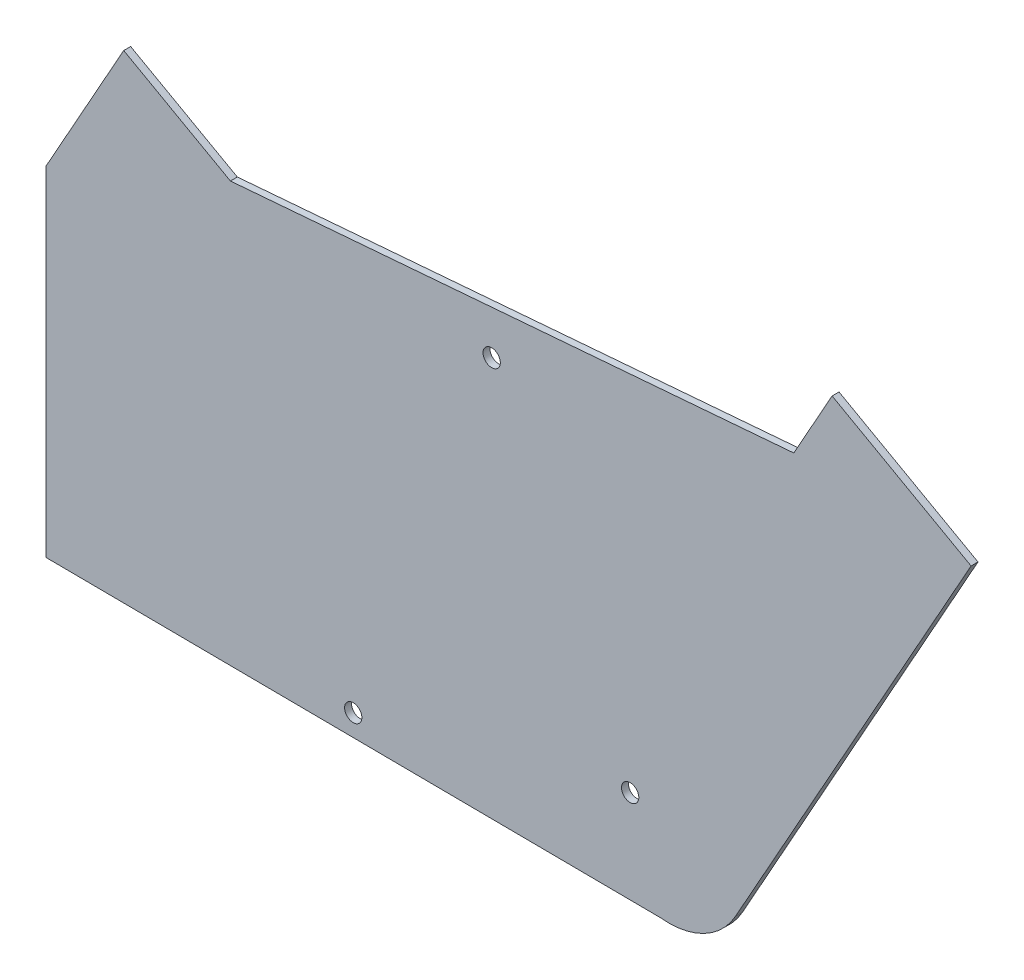
ISO-10303-21;
HEADER;
FILE_DESCRIPTION(('STEP AP214'),'2;1');
FILE_NAME('part.step','',(''),(''),'','','');
FILE_SCHEMA(('AUTOMOTIVE_DESIGN { 1 0 10303 214 1 1 1 1 }'));
ENDSEC;
DATA;
#1=APPLICATION_CONTEXT('core data for automotive mechanical design processes');
#2=APPLICATION_PROTOCOL_DEFINITION('international standard','automotive_design',2000,#1);
#3=PRODUCT_CONTEXT('',#1,'mechanical');
#4=PRODUCT('Part','Part','',(#3));
#5=PRODUCT_RELATED_PRODUCT_CATEGORY('part','',(#4));
#6=PRODUCT_DEFINITION_FORMATION('','',#4);
#7=PRODUCT_DEFINITION_CONTEXT('part definition',#1,'design');
#8=PRODUCT_DEFINITION('design','',#6,#7);
#9=PRODUCT_DEFINITION_SHAPE('','',#8);
#10=(LENGTH_UNIT() NAMED_UNIT(*) SI_UNIT(.MILLI.,.METRE.));
#11=(NAMED_UNIT(*) PLANE_ANGLE_UNIT() SI_UNIT($,.RADIAN.));
#12=(NAMED_UNIT(*) SI_UNIT($,.STERADIAN.) SOLID_ANGLE_UNIT());
#13=UNCERTAINTY_MEASURE_WITH_UNIT(LENGTH_MEASURE(1.E-05),#10,'distance_accuracy_value','');
#14=(GEOMETRIC_REPRESENTATION_CONTEXT(3) GLOBAL_UNCERTAINTY_ASSIGNED_CONTEXT((#13)) GLOBAL_UNIT_ASSIGNED_CONTEXT((#10,
#11,#12)) REPRESENTATION_CONTEXT('',''));
#15=CARTESIAN_POINT('',(0.,0.,0.));
#16=DIRECTION('',(0.,0.,1.));
#17=DIRECTION('',(1.,0.,0.));
#18=AXIS2_PLACEMENT_3D('',#15,#16,#17);
#19=CARTESIAN_POINT('',(10.6517431246805,-43.3937672054265,2.54));
#20=DIRECTION('',(0.,0.,-1.));
#21=DIRECTION('',(-1.,0.,0.));
#22=AXIS2_PLACEMENT_3D('',#19,#20,#21);
#23=CYLINDRICAL_SURFACE('',#22,27.94);
#24=CARTESIAN_POINT('',(10.6517431246805,-43.3937672054265,0.));
#25=DIRECTION('',(0.,0.,1.));
#26=DIRECTION('',(-1.,0.,0.));
#27=AXIS2_PLACEMENT_3D('',#24,#25,#26);
#28=CIRCLE('',#27,27.94);
#29=CARTESIAN_POINT('',(7.61068495066728,-71.1677760119036,0.));
#30=VERTEX_POINT('',#29);
#31=CARTESIAN_POINT('',(35.036266463821,-57.0333647626462,0.));
#32=VERTEX_POINT('',#31);
#33=EDGE_CURVE('E150',#30,#32,#28,.T.);
#34=ORIENTED_EDGE('',*,*,#33,.T.);
#35=DIRECTION('',(0.,0.,-1.));
#36=VECTOR('',#35,1.);
#37=CARTESIAN_POINT('',(35.036266463821,-57.0333647626462,2.54));
#38=LINE('',#37,#36);
#39=CARTESIAN_POINT('',(35.036266463821,-57.0333647626462,2.54));
#40=VERTEX_POINT('',#39);
#41=EDGE_CURVE('E11',#40,#32,#38,.T.);
#42=ORIENTED_EDGE('',*,*,#41,.F.);
#43=CARTESIAN_POINT('',(10.6517431246805,-43.3937672054265,2.54));
#44=DIRECTION('',(0.,0.,1.));
#45=DIRECTION('',(-1.,0.,0.));
#46=AXIS2_PLACEMENT_3D('',#43,#44,#45);
#47=CIRCLE('',#46,27.94);
#48=CARTESIAN_POINT('',(7.61068495066728,-71.1677760119036,2.54));
#49=VERTEX_POINT('',#48);
#50=EDGE_CURVE('E176',#49,#40,#47,.T.);
#51=ORIENTED_EDGE('',*,*,#50,.F.);
#52=DIRECTION('',(0.,0.,-1.));
#53=VECTOR('',#52,1.);
#54=CARTESIAN_POINT('',(7.61068495066728,-71.1677760119036,2.54));
#55=LINE('',#54,#53);
#56=EDGE_CURVE('E146',#49,#30,#55,.T.);
#57=ORIENTED_EDGE('',*,*,#56,.T.);
#58=EDGE_LOOP('',(#34,#42,#51,#57));
#59=FACE_BOUND('',#58,.T.);
#60=ADVANCED_FACE('F43',(#59),#23,.T.);
#61=CARTESIAN_POINT('',(121.527407416468,97.5932828595444,2.54));
#62=DIRECTION('',(-0.872746003548334,0.488174572556182,0.));
#63=DIRECTION('',(-0.488174572556182,-0.872746003548334,0.));
#64=AXIS2_PLACEMENT_3D('',#61,#62,#63);
#65=PLANE('',#64);
#66=DIRECTION('',(0.488174572556182,0.872746003548334,0.));
#67=VECTOR('',#66,1.);
#68=CARTESIAN_POINT('',(121.527407416468,97.5932828595444,0.));
#69=LINE('',#68,#67);
#70=CARTESIAN_POINT('',(121.527407416468,97.5932828595444,0.));
#71=VERTEX_POINT('',#70);
#72=EDGE_CURVE('E154',#32,#71,#69,.T.);
#73=ORIENTED_EDGE('',*,*,#72,.T.);
#74=DIRECTION('',(0.,0.,-1.));
#75=VECTOR('',#74,1.);
#76=CARTESIAN_POINT('',(121.527407416468,97.5932828595444,2.54));
#77=LINE('',#76,#75);
#78=CARTESIAN_POINT('',(121.527407416468,97.5932828595444,2.54));
#79=VERTEX_POINT('',#78);
#80=EDGE_CURVE('E52',#79,#71,#77,.T.);
#81=ORIENTED_EDGE('',*,*,#80,.F.);
#82=DIRECTION('',(0.488174572556182,0.872746003548334,0.));
#83=VECTOR('',#82,1.);
#84=CARTESIAN_POINT('',(121.527407416468,97.5932828595444,2.54));
#85=LINE('',#84,#83);
#86=EDGE_CURVE('E106',#40,#79,#85,.T.);
#87=ORIENTED_EDGE('',*,*,#86,.F.);
#88=ORIENTED_EDGE('',*,*,#41,.T.);
#89=EDGE_LOOP('',(#73,#81,#87,#88));
#90=FACE_BOUND('',#89,.T.);
#91=ADVANCED_FACE('F284',(#90),#65,.F.);
#92=CARTESIAN_POINT('',(70.5415858891742,126.112441388277,2.54));
#93=DIRECTION('',(-0.488174572556182,-0.872746003548334,0.));
#94=DIRECTION('',(0.872746003548334,-0.488174572556182,0.));
#95=AXIS2_PLACEMENT_3D('',#92,#93,#94);
#96=PLANE('',#95);
#97=DIRECTION('',(-0.872746003548334,0.488174572556182,0.));
#98=VECTOR('',#97,1.);
#99=CARTESIAN_POINT('',(70.5415858891742,126.112441388277,0.));
#100=LINE('',#99,#98);
#101=CARTESIAN_POINT('',(70.5415858891742,126.112441388277,0.));
#102=VERTEX_POINT('',#101);
#103=EDGE_CURVE('E158',#71,#102,#100,.T.);
#104=ORIENTED_EDGE('',*,*,#103,.T.);
#105=DIRECTION('',(0.,0.,-1.));
#106=VECTOR('',#105,1.);
#107=CARTESIAN_POINT('',(70.5415858891742,126.112441388277,2.54));
#108=LINE('',#107,#106);
#109=CARTESIAN_POINT('',(70.5415858891742,126.112441388277,2.54));
#110=VERTEX_POINT('',#109);
#111=EDGE_CURVE('E191',#110,#102,#108,.T.);
#112=ORIENTED_EDGE('',*,*,#111,.F.);
#113=DIRECTION('',(-0.872746003548334,0.488174572556182,0.));
#114=VECTOR('',#113,1.);
#115=CARTESIAN_POINT('',(70.5415858891742,126.112441388277,2.54));
#116=LINE('',#115,#114);
#117=EDGE_CURVE('E201',#79,#110,#116,.T.);
#118=ORIENTED_EDGE('',*,*,#117,.F.);
#119=ORIENTED_EDGE('',*,*,#80,.T.);
#120=EDGE_LOOP('',(#104,#112,#118,#119));
#121=FACE_BOUND('',#120,.T.);
#122=ADVANCED_FACE('F199',(#121),#96,.F.);
#123=CARTESIAN_POINT('',(56.4755919428829,100.9656175005,2.54));
#124=DIRECTION('',(0.872746003548335,-0.488174572556181,0.));
#125=DIRECTION('',(0.488174572556181,0.872746003548335,0.));
#126=AXIS2_PLACEMENT_3D('',#123,#124,#125);
#127=PLANE('',#126);
#128=DIRECTION('',(-0.488174572556181,-0.872746003548335,0.));
#129=VECTOR('',#128,1.);
#130=CARTESIAN_POINT('',(56.4755919428829,100.9656175005,0.));
#131=LINE('',#130,#129);
#132=CARTESIAN_POINT('',(56.4755919428829,100.9656175005,0.));
#133=VERTEX_POINT('',#132);
#134=EDGE_CURVE('E161',#102,#133,#131,.T.);
#135=ORIENTED_EDGE('',*,*,#134,.T.);
#136=DIRECTION('',(0.,0.,-1.));
#137=VECTOR('',#136,1.);
#138=CARTESIAN_POINT('',(56.4755919428829,100.9656175005,2.54));
#139=LINE('',#138,#137);
#140=CARTESIAN_POINT('',(56.4755919428829,100.9656175005,2.54));
#141=VERTEX_POINT('',#140);
#142=EDGE_CURVE('E187',#141,#133,#139,.T.);
#143=ORIENTED_EDGE('',*,*,#142,.F.);
#144=DIRECTION('',(-0.488174572556181,-0.872746003548335,0.));
#145=VECTOR('',#144,1.);
#146=CARTESIAN_POINT('',(56.4755919428829,100.9656175005,2.54));
#147=LINE('',#146,#145);
#148=EDGE_CURVE('E218',#110,#141,#147,.T.);
#149=ORIENTED_EDGE('',*,*,#148,.F.);
#150=ORIENTED_EDGE('',*,*,#111,.T.);
#151=EDGE_LOOP('',(#135,#143,#149,#150));
#152=FACE_BOUND('',#151,.T.);
#153=ADVANCED_FACE('F210',(#152),#127,.F.);
#154=CARTESIAN_POINT('',(-150.227007979346,84.0301818725545,2.54));
#155=DIRECTION('',(0.0816577947837422,-0.996660425897936,0.));
#156=DIRECTION('',(0.996660425897937,0.0816577947837422,0.));
#157=AXIS2_PLACEMENT_3D('',#154,#155,#156);
#158=PLANE('',#157);
#159=DIRECTION('',(-0.996660425897937,-0.0816577947837422,0.));
#160=VECTOR('',#159,1.);
#161=CARTESIAN_POINT('',(-150.227007979346,84.0301818725545,0.));
#162=LINE('',#161,#160);
#163=CARTESIAN_POINT('',(-150.227007979346,84.0301818725545,0.));
#164=VERTEX_POINT('',#163);
#165=EDGE_CURVE('E164',#133,#164,#162,.T.);
#166=ORIENTED_EDGE('',*,*,#165,.T.);
#167=DIRECTION('',(0.,0.,-1.));
#168=VECTOR('',#167,1.);
#169=CARTESIAN_POINT('',(-150.227007979346,84.0301818725545,2.54));
#170=LINE('',#169,#168);
#171=CARTESIAN_POINT('',(-150.227007979346,84.0301818725545,2.54));
#172=VERTEX_POINT('',#171);
#173=EDGE_CURVE('E183',#172,#164,#170,.T.);
#174=ORIENTED_EDGE('',*,*,#173,.F.);
#175=DIRECTION('',(-0.996660425897937,-0.0816577947837422,0.));
#176=VECTOR('',#175,1.);
#177=CARTESIAN_POINT('',(-150.227007979346,84.0301818725545,2.54));
#178=LINE('',#177,#176);
#179=EDGE_CURVE('E216',#141,#172,#178,.T.);
#180=ORIENTED_EDGE('',*,*,#179,.F.);
#181=ORIENTED_EDGE('',*,*,#142,.T.);
#182=EDGE_LOOP('',(#166,#174,#180,#181));
#183=FACE_BOUND('',#182,.T.);
#184=ADVANCED_FACE('F214',(#183),#158,.F.);
#185=CARTESIAN_POINT('',(-189.368571031903,105.924198842756,2.54));
#186=DIRECTION('',(-0.488174572556182,-0.872746003548334,0.));
#187=DIRECTION('',(0.872746003548334,-0.488174572556182,0.));
#188=AXIS2_PLACEMENT_3D('',#185,#186,#187);
#189=PLANE('',#188);
#190=DIRECTION('',(-0.872746003548334,0.488174572556182,0.));
#191=VECTOR('',#190,1.);
#192=CARTESIAN_POINT('',(-189.368571031903,105.924198842756,0.));
#193=LINE('',#192,#191);
#194=CARTESIAN_POINT('',(-189.368571031903,105.924198842756,0.));
#195=VERTEX_POINT('',#194);
#196=EDGE_CURVE('E167',#164,#195,#193,.T.);
#197=ORIENTED_EDGE('',*,*,#196,.T.);
#198=DIRECTION('',(0.,0.,-1.));
#199=VECTOR('',#198,1.);
#200=CARTESIAN_POINT('',(-189.368571031903,105.924198842756,2.54));
#201=LINE('',#200,#199);
#202=CARTESIAN_POINT('',(-189.368571031903,105.924198842756,2.54));
#203=VERTEX_POINT('',#202);
#204=EDGE_CURVE('E139',#203,#195,#201,.T.);
#205=ORIENTED_EDGE('',*,*,#204,.F.);
#206=DIRECTION('',(-0.872746003548334,0.488174572556182,0.));
#207=VECTOR('',#206,1.);
#208=CARTESIAN_POINT('',(-189.368571031903,105.924198842756,2.54));
#209=LINE('',#208,#207);
#210=EDGE_CURVE('E128',#172,#203,#209,.T.);
#211=ORIENTED_EDGE('',*,*,#210,.F.);
#212=ORIENTED_EDGE('',*,*,#173,.T.);
#213=EDGE_LOOP('',(#197,#205,#211,#212));
#214=FACE_BOUND('',#213,.T.);
#215=ADVANCED_FACE('F292',(#214),#189,.F.);
#216=CARTESIAN_POINT('',(-217.887729560635,54.9383773154621,2.54));
#217=DIRECTION('',(0.872746003548334,-0.488174572556182,0.));
#218=DIRECTION('',(0.488174572556182,0.872746003548334,0.));
#219=AXIS2_PLACEMENT_3D('',#216,#217,#218);
#220=PLANE('',#219);
#221=DIRECTION('',(-0.488174572556182,-0.872746003548334,0.));
#222=VECTOR('',#221,1.);
#223=CARTESIAN_POINT('',(-217.887729560635,54.9383773154621,0.));
#224=LINE('',#223,#222);
#225=CARTESIAN_POINT('',(-217.887729560635,54.9383773154621,0.));
#226=VERTEX_POINT('',#225);
#227=EDGE_CURVE('E137',#195,#226,#224,.T.);
#228=ORIENTED_EDGE('',*,*,#227,.T.);
#229=DIRECTION('',(0.,0.,-1.));
#230=VECTOR('',#229,1.);
#231=CARTESIAN_POINT('',(-217.887729560635,54.9383773154621,2.54));
#232=LINE('',#231,#230);
#233=CARTESIAN_POINT('',(-217.887729560635,54.9383773154621,2.54));
#234=VERTEX_POINT('',#233);
#235=EDGE_CURVE('E134',#234,#226,#232,.T.);
#236=ORIENTED_EDGE('',*,*,#235,.F.);
#237=DIRECTION('',(-0.488174572556182,-0.872746003548334,0.));
#238=VECTOR('',#237,1.);
#239=CARTESIAN_POINT('',(-217.887729560635,54.9383773154621,2.54));
#240=LINE('',#239,#238);
#241=EDGE_CURVE('E122',#203,#234,#240,.T.);
#242=ORIENTED_EDGE('',*,*,#241,.F.);
#243=ORIENTED_EDGE('',*,*,#204,.T.);
#244=EDGE_LOOP('',(#228,#236,#242,#243));
#245=FACE_BOUND('',#244,.T.);
#246=ADVANCED_FACE('F135',(#245),#220,.F.);
#247=CARTESIAN_POINT('',(-217.887729560635,54.9383773154621,2.54));
#248=DIRECTION('',(1.,0.,0.));
#249=DIRECTION('',(0.,0.,-1.));
#250=AXIS2_PLACEMENT_3D('',#247,#248,#249);
#251=PLANE('',#250);
#252=DIRECTION('',(0.,-1.,0.));
#253=VECTOR('',#252,1.);
#254=CARTESIAN_POINT('',(-217.887729560635,54.9383773154621,0.));
#255=LINE('',#254,#253);
#256=CARTESIAN_POINT('',(-217.887729560635,-69.4208591596651,0.));
#257=VERTEX_POINT('',#256);
#258=EDGE_CURVE('E92',#226,#257,#255,.T.);
#259=ORIENTED_EDGE('',*,*,#258,.T.);
#260=DIRECTION('',(0.,0.,-1.));
#261=VECTOR('',#260,1.);
#262=CARTESIAN_POINT('',(-217.887729560635,-69.4208591596651,2.54));
#263=LINE('',#262,#261);
#264=CARTESIAN_POINT('',(-217.887729560635,-69.4208591596651,2.54));
#265=VERTEX_POINT('',#264);
#266=EDGE_CURVE('E140',#265,#257,#263,.T.);
#267=ORIENTED_EDGE('',*,*,#266,.F.);
#268=DIRECTION('',(0.,-1.,0.));
#269=VECTOR('',#268,1.);
#270=CARTESIAN_POINT('',(-217.887729560635,54.9383773154621,2.54));
#271=LINE('',#270,#269);
#272=EDGE_CURVE('E126',#234,#265,#271,.T.);
#273=ORIENTED_EDGE('',*,*,#272,.F.);
#274=ORIENTED_EDGE('',*,*,#235,.T.);
#275=EDGE_LOOP('',(#259,#267,#273,#274));
#276=FACE_BOUND('',#275,.T.);
#277=ADVANCED_FACE('F142',(#276),#251,.F.);
#278=CARTESIAN_POINT('',(-217.887729560635,-69.4208591596651,2.54));
#279=DIRECTION('',(0.00774668166983374,0.999969994011373,0.));
#280=DIRECTION('',(-0.999969994011374,0.00774668166983374,0.));
#281=AXIS2_PLACEMENT_3D('',#278,#279,#280);
#282=PLANE('',#281);
#283=DIRECTION('',(0.999969994011373,-0.00774668166983374,0.));
#284=VECTOR('',#283,1.);
#285=CARTESIAN_POINT('',(-217.887729560635,-69.4208591596651,0.));
#286=LINE('',#285,#284);
#287=EDGE_CURVE('E98',#257,#30,#286,.T.);
#288=ORIENTED_EDGE('',*,*,#287,.T.);
#289=ORIENTED_EDGE('',*,*,#56,.F.);
#290=DIRECTION('',(0.999969994011373,-0.00774668166983374,0.));
#291=VECTOR('',#290,1.);
#292=CARTESIAN_POINT('',(-217.887729560635,-69.4208591596651,2.54));
#293=LINE('',#292,#291);
#294=EDGE_CURVE('E60',#265,#49,#293,.T.);
#295=ORIENTED_EDGE('',*,*,#294,.F.);
#296=ORIENTED_EDGE('',*,*,#266,.T.);
#297=EDGE_LOOP('',(#288,#289,#295,#296));
#298=FACE_BOUND('',#297,.T.);
#299=ADVANCED_FACE('F265',(#298),#282,.F.);
#300=CARTESIAN_POINT('',(10.6517431246805,-43.3937672054265,2.54));
#301=DIRECTION('',(0.,0.,-1.));
#302=DIRECTION('',(-1.,0.,0.));
#303=AXIS2_PLACEMENT_3D('',#300,#301,#302);
#304=PLANE('',#303);
#305=CARTESIAN_POINT('',(-3.56263015099331,-36.9677729504123,2.54));
#306=DIRECTION('',(0.,0.,1.));
#307=DIRECTION('',(1.,0.,0.));
#308=AXIS2_PLACEMENT_3D('',#305,#306,#307);
#309=CIRCLE('',#308,3.175);
#310=CARTESIAN_POINT('',(-0.387630150993316,-36.9677729504123,2.54));
#311=VERTEX_POINT('',#310);
#312=EDGE_CURVE('E246',#311,#311,#309,.T.);
#313=ORIENTED_EDGE('',*,*,#312,.F.);
#314=EDGE_LOOP('',(#313));
#315=FACE_BOUND('',#314,.T.);
#316=CARTESIAN_POINT('',(-54.3626301509933,75.8082270495877,2.54));
#317=DIRECTION('',(0.,0.,1.));
#318=DIRECTION('',(1.,0.,0.));
#319=AXIS2_PLACEMENT_3D('',#316,#317,#318);
#320=CIRCLE('',#319,3.175);
#321=CARTESIAN_POINT('',(-51.1876301509933,75.8082270495877,2.54));
#322=VERTEX_POINT('',#321);
#323=EDGE_CURVE('E238',#322,#322,#320,.T.);
#324=ORIENTED_EDGE('',*,*,#323,.F.);
#325=EDGE_LOOP('',(#324));
#326=FACE_BOUND('',#325,.T.);
#327=CARTESIAN_POINT('',(-105.162630150993,-62.3677729504123,2.54));
#328=DIRECTION('',(0.,0.,1.));
#329=DIRECTION('',(1.,0.,0.));
#330=AXIS2_PLACEMENT_3D('',#327,#328,#329);
#331=CIRCLE('',#330,3.175);
#332=CARTESIAN_POINT('',(-101.987630150993,-62.3677729504123,2.54));
#333=VERTEX_POINT('',#332);
#334=EDGE_CURVE('E230',#333,#333,#331,.T.);
#335=ORIENTED_EDGE('',*,*,#334,.F.);
#336=EDGE_LOOP('',(#335));
#337=FACE_BOUND('',#336,.T.);
#338=ORIENTED_EDGE('',*,*,#50,.T.);
#339=ORIENTED_EDGE('',*,*,#86,.T.);
#340=ORIENTED_EDGE('',*,*,#117,.T.);
#341=ORIENTED_EDGE('',*,*,#148,.T.);
#342=ORIENTED_EDGE('',*,*,#179,.T.);
#343=ORIENTED_EDGE('',*,*,#210,.T.);
#344=ORIENTED_EDGE('',*,*,#241,.T.);
#345=ORIENTED_EDGE('',*,*,#272,.T.);
#346=ORIENTED_EDGE('',*,*,#294,.T.);
#347=EDGE_LOOP('',(#338,#339,#340,#341,#342,#343,#344,#345,#346));
#348=FACE_BOUND('',#347,.T.);
#349=ADVANCED_FACE('F124',(#315,#326,#337,#348),#304,.F.);
#350=CARTESIAN_POINT('',(10.6517431246805,-43.3937672054265,0.));
#351=DIRECTION('',(0.,0.,-1.));
#352=DIRECTION('',(-1.,0.,0.));
#353=AXIS2_PLACEMENT_3D('',#350,#351,#352);
#354=PLANE('',#353);
#355=CARTESIAN_POINT('',(-3.56263015099331,-36.9677729504123,0.));
#356=DIRECTION('',(0.,0.,1.));
#357=DIRECTION('',(1.,0.,0.));
#358=AXIS2_PLACEMENT_3D('',#355,#356,#357);
#359=CIRCLE('',#358,3.175);
#360=CARTESIAN_POINT('',(-0.387630150993316,-36.9677729504123,0.));
#361=VERTEX_POINT('',#360);
#362=EDGE_CURVE('E155',#361,#361,#359,.T.);
#363=ORIENTED_EDGE('',*,*,#362,.T.);
#364=EDGE_LOOP('',(#363));
#365=FACE_BOUND('',#364,.T.);
#366=CARTESIAN_POINT('',(-54.3626301509933,75.8082270495877,0.));
#367=DIRECTION('',(0.,0.,1.));
#368=DIRECTION('',(1.,0.,0.));
#369=AXIS2_PLACEMENT_3D('',#366,#367,#368);
#370=CIRCLE('',#369,3.175);
#371=CARTESIAN_POINT('',(-51.1876301509933,75.8082270495877,0.));
#372=VERTEX_POINT('',#371);
#373=EDGE_CURVE('E242',#372,#372,#370,.T.);
#374=ORIENTED_EDGE('',*,*,#373,.T.);
#375=EDGE_LOOP('',(#374));
#376=FACE_BOUND('',#375,.T.);
#377=CARTESIAN_POINT('',(-105.162630150993,-62.3677729504123,0.));
#378=DIRECTION('',(0.,0.,1.));
#379=DIRECTION('',(1.,0.,0.));
#380=AXIS2_PLACEMENT_3D('',#377,#378,#379);
#381=CIRCLE('',#380,3.175);
#382=CARTESIAN_POINT('',(-101.987630150993,-62.3677729504123,0.));
#383=VERTEX_POINT('',#382);
#384=EDGE_CURVE('E234',#383,#383,#381,.T.);
#385=ORIENTED_EDGE('',*,*,#384,.T.);
#386=EDGE_LOOP('',(#385));
#387=FACE_BOUND('',#386,.T.);
#388=ORIENTED_EDGE('',*,*,#33,.F.);
#389=ORIENTED_EDGE('',*,*,#287,.F.);
#390=ORIENTED_EDGE('',*,*,#258,.F.);
#391=ORIENTED_EDGE('',*,*,#227,.F.);
#392=ORIENTED_EDGE('',*,*,#196,.F.);
#393=ORIENTED_EDGE('',*,*,#165,.F.);
#394=ORIENTED_EDGE('',*,*,#134,.F.);
#395=ORIENTED_EDGE('',*,*,#103,.F.);
#396=ORIENTED_EDGE('',*,*,#72,.F.);
#397=EDGE_LOOP('',(#388,#389,#390,#391,#392,#393,#394,#395,#396));
#398=FACE_BOUND('',#397,.T.);
#399=ADVANCED_FACE('F205',(#365,#376,#387,#398),#354,.T.);
#400=CARTESIAN_POINT('',(-105.162630150993,-62.3677729504123,0.));
#401=DIRECTION('',(0.,0.,1.));
#402=DIRECTION('',(1.,0.,0.));
#403=AXIS2_PLACEMENT_3D('',#400,#401,#402);
#404=CYLINDRICAL_SURFACE('',#403,3.175);
#405=ORIENTED_EDGE('',*,*,#384,.F.);
#406=EDGE_LOOP('',(#405));
#407=FACE_BOUND('',#406,.T.);
#408=ORIENTED_EDGE('',*,*,#334,.T.);
#409=EDGE_LOOP('',(#408));
#410=FACE_BOUND('',#409,.T.);
#411=ADVANCED_FACE('F271',(#407,#410),#404,.F.);
#412=CARTESIAN_POINT('',(-54.3626301509933,75.8082270495877,0.));
#413=DIRECTION('',(0.,0.,1.));
#414=DIRECTION('',(1.,0.,0.));
#415=AXIS2_PLACEMENT_3D('',#412,#413,#414);
#416=CYLINDRICAL_SURFACE('',#415,3.175);
#417=ORIENTED_EDGE('',*,*,#373,.F.);
#418=EDGE_LOOP('',(#417));
#419=FACE_BOUND('',#418,.T.);
#420=ORIENTED_EDGE('',*,*,#323,.T.);
#421=EDGE_LOOP('',(#420));
#422=FACE_BOUND('',#421,.T.);
#423=ADVANCED_FACE('F259',(#419,#422),#416,.F.);
#424=CARTESIAN_POINT('',(-3.56263015099331,-36.9677729504123,0.));
#425=DIRECTION('',(0.,0.,1.));
#426=DIRECTION('',(1.,0.,0.));
#427=AXIS2_PLACEMENT_3D('',#424,#425,#426);
#428=CYLINDRICAL_SURFACE('',#427,3.175);
#429=ORIENTED_EDGE('',*,*,#362,.F.);
#430=EDGE_LOOP('',(#429));
#431=FACE_BOUND('',#430,.T.);
#432=ORIENTED_EDGE('',*,*,#312,.T.);
#433=EDGE_LOOP('',(#432));
#434=FACE_BOUND('',#433,.T.);
#435=ADVANCED_FACE('F256',(#431,#434),#428,.F.);
#436=CLOSED_SHELL('',(#60,#91,#122,#153,#184,#215,#246,#277,#299,#349,#399,#411,#423,#435));
#437=MANIFOLD_SOLID_BREP('B2',#436);
#438=ADVANCED_BREP_SHAPE_REPRESENTATION('',(#18,#437),#14);
#439=SHAPE_DEFINITION_REPRESENTATION(#9,#438);
ENDSEC;
END-ISO-10303-21;
